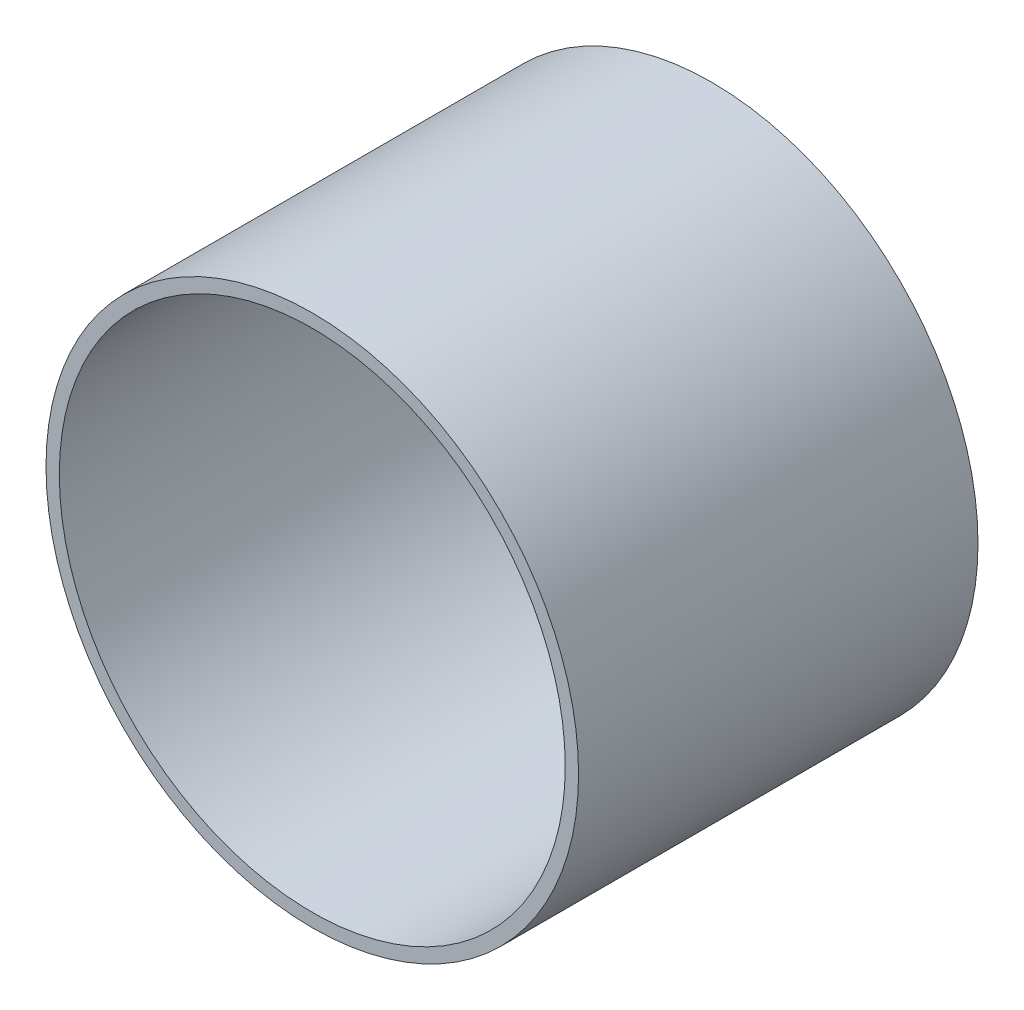
ISO-10303-21;
HEADER;
FILE_DESCRIPTION(('STEP AP214'),'2;1');
FILE_NAME('part.step','',(''),(''),'','','');
FILE_SCHEMA(('AUTOMOTIVE_DESIGN { 1 0 10303 214 1 1 1 1 }'));
ENDSEC;
DATA;
#1=APPLICATION_CONTEXT('core data for automotive mechanical design processes');
#2=APPLICATION_PROTOCOL_DEFINITION('international standard','automotive_design',2000,#1);
#3=PRODUCT_CONTEXT('',#1,'mechanical');
#4=PRODUCT('Part','Part','',(#3));
#5=PRODUCT_RELATED_PRODUCT_CATEGORY('part','',(#4));
#6=PRODUCT_DEFINITION_FORMATION('','',#4);
#7=PRODUCT_DEFINITION_CONTEXT('part definition',#1,'design');
#8=PRODUCT_DEFINITION('design','',#6,#7);
#9=PRODUCT_DEFINITION_SHAPE('','',#8);
#10=(LENGTH_UNIT() NAMED_UNIT(*) SI_UNIT(.MILLI.,.METRE.));
#11=(NAMED_UNIT(*) PLANE_ANGLE_UNIT() SI_UNIT($,.RADIAN.));
#12=(NAMED_UNIT(*) SI_UNIT($,.STERADIAN.) SOLID_ANGLE_UNIT());
#13=UNCERTAINTY_MEASURE_WITH_UNIT(LENGTH_MEASURE(1.E-05),#10,'distance_accuracy_value','');
#14=(GEOMETRIC_REPRESENTATION_CONTEXT(3) GLOBAL_UNCERTAINTY_ASSIGNED_CONTEXT((#13)) GLOBAL_UNIT_ASSIGNED_CONTEXT((#10,
#11,#12)) REPRESENTATION_CONTEXT('',''));
#15=CARTESIAN_POINT('',(0.,0.,0.));
#16=DIRECTION('',(0.,0.,1.));
#17=DIRECTION('',(1.,0.,0.));
#18=AXIS2_PLACEMENT_3D('',#15,#16,#17);
#19=CARTESIAN_POINT('',(0.,0.,160.));
#20=DIRECTION('',(0.,0.,-1.));
#21=DIRECTION('',(-1.,0.,0.));
#22=AXIS2_PLACEMENT_3D('',#19,#20,#21);
#23=CYLINDRICAL_SURFACE('',#22,100.);
#24=CARTESIAN_POINT('',(0.,0.,0.));
#25=DIRECTION('',(0.,0.,1.));
#26=DIRECTION('',(1.,0.,0.));
#27=AXIS2_PLACEMENT_3D('',#24,#25,#26);
#28=CIRCLE('',#27,100.);
#29=CARTESIAN_POINT('',(100.,0.,0.));
#30=VERTEX_POINT('',#29);
#31=EDGE_CURVE('E10',#30,#30,#28,.T.);
#32=ORIENTED_EDGE('',*,*,#31,.T.);
#33=EDGE_LOOP('',(#32));
#34=FACE_BOUND('',#33,.T.);
#35=CARTESIAN_POINT('',(0.,0.,150.));
#36=DIRECTION('',(0.,0.,1.));
#37=DIRECTION('',(1.,0.,0.));
#38=AXIS2_PLACEMENT_3D('',#35,#36,#37);
#39=CIRCLE('',#38,100.);
#40=CARTESIAN_POINT('',(100.,0.,150.));
#41=VERTEX_POINT('',#40);
#42=EDGE_CURVE('E62',#41,#41,#39,.T.);
#43=ORIENTED_EDGE('',*,*,#42,.F.);
#44=EDGE_LOOP('',(#43));
#45=FACE_BOUND('',#44,.T.);
#46=ADVANCED_FACE('F43',(#34,#45),#23,.T.);
#47=CARTESIAN_POINT('',(0.,0.,0.));
#48=DIRECTION('',(0.,0.,1.));
#49=DIRECTION('',(1.,0.,0.));
#50=AXIS2_PLACEMENT_3D('',#47,#48,#49);
#51=PLANE('',#50);
#52=CARTESIAN_POINT('',(0.,0.,0.));
#53=DIRECTION('',(0.,0.,-1.));
#54=DIRECTION('',(-1.,0.,0.));
#55=AXIS2_PLACEMENT_3D('',#52,#53,#54);
#56=CIRCLE('',#55,95.);
#57=CARTESIAN_POINT('',(-95.,0.,0.));
#58=VERTEX_POINT('',#57);
#59=EDGE_CURVE('E50',#58,#58,#56,.T.);
#60=ORIENTED_EDGE('',*,*,#59,.F.);
#61=EDGE_LOOP('',(#60));
#62=FACE_BOUND('',#61,.T.);
#63=ORIENTED_EDGE('',*,*,#31,.F.);
#64=EDGE_LOOP('',(#63));
#65=FACE_BOUND('',#64,.T.);
#66=ADVANCED_FACE('F74',(#62,#65),#51,.F.);
#67=CARTESIAN_POINT('',(0.,0.,150.));
#68=DIRECTION('',(0.,0.,-1.));
#69=DIRECTION('',(-1.,0.,0.));
#70=AXIS2_PLACEMENT_3D('',#67,#68,#69);
#71=CYLINDRICAL_SURFACE('',#70,95.);
#72=CARTESIAN_POINT('',(0.,0.,150.));
#73=DIRECTION('',(0.,0.,1.));
#74=DIRECTION('',(1.,0.,0.));
#75=AXIS2_PLACEMENT_3D('',#72,#73,#74);
#76=CIRCLE('',#75,95.);
#77=CARTESIAN_POINT('',(95.,0.,150.));
#78=VERTEX_POINT('',#77);
#79=EDGE_CURVE('E56',#78,#78,#76,.F.);
#80=ORIENTED_EDGE('',*,*,#79,.F.);
#81=EDGE_LOOP('',(#80));
#82=FACE_BOUND('',#81,.T.);
#83=ORIENTED_EDGE('',*,*,#59,.T.);
#84=EDGE_LOOP('',(#83));
#85=FACE_BOUND('',#84,.T.);
#86=ADVANCED_FACE('F78',(#82,#85),#71,.F.);
#87=CARTESIAN_POINT('',(0.,0.,150.));
#88=DIRECTION('',(0.,0.,1.));
#89=DIRECTION('',(1.,0.,0.));
#90=AXIS2_PLACEMENT_3D('',#87,#88,#89);
#91=PLANE('',#90);
#92=ORIENTED_EDGE('',*,*,#42,.T.);
#93=EDGE_LOOP('',(#92));
#94=FACE_BOUND('',#93,.T.);
#95=ORIENTED_EDGE('',*,*,#79,.T.);
#96=EDGE_LOOP('',(#95));
#97=FACE_BOUND('',#96,.T.);
#98=ADVANCED_FACE('F70',(#94,#97),#91,.T.);
#99=CLOSED_SHELL('',(#46,#66,#86,#98));
#100=MANIFOLD_SOLID_BREP('B2',#99);
#101=ADVANCED_BREP_SHAPE_REPRESENTATION('',(#18,#100),#14);
#102=SHAPE_DEFINITION_REPRESENTATION(#9,#101);
ENDSEC;
END-ISO-10303-21;
